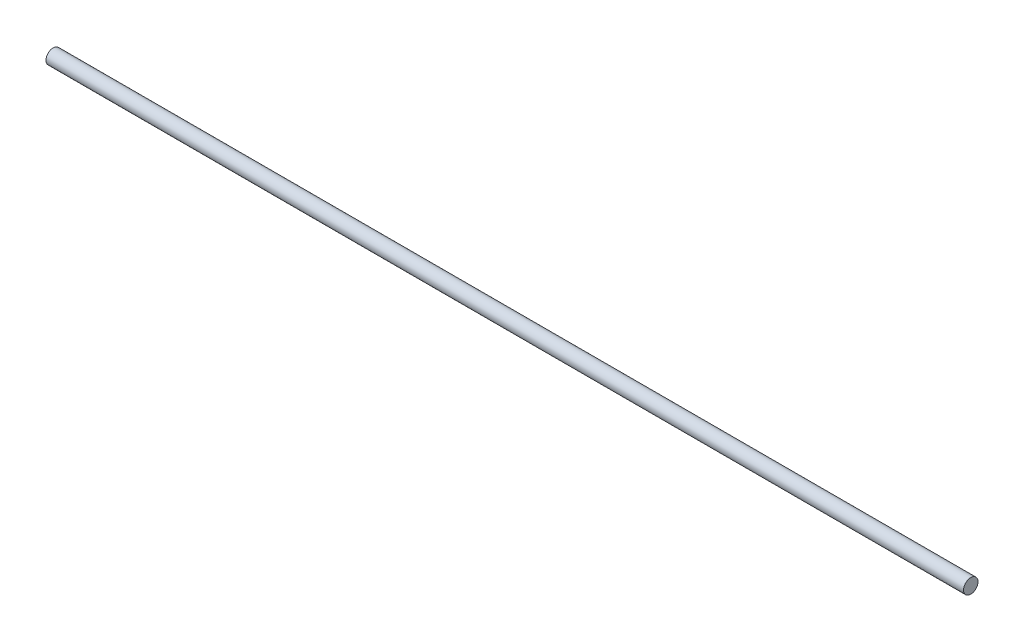
ISO-10303-21;
HEADER;
FILE_DESCRIPTION(('STEP AP214'),'2;1');
FILE_NAME('part.step','',(''),(''),'','','');
FILE_SCHEMA(('AUTOMOTIVE_DESIGN { 1 0 10303 214 1 1 1 1 }'));
ENDSEC;
DATA;
#1=APPLICATION_CONTEXT('core data for automotive mechanical design processes');
#2=APPLICATION_PROTOCOL_DEFINITION('international standard','automotive_design',2000,#1);
#3=PRODUCT_CONTEXT('',#1,'mechanical');
#4=PRODUCT('Part','Part','',(#3));
#5=PRODUCT_RELATED_PRODUCT_CATEGORY('part','',(#4));
#6=PRODUCT_DEFINITION_FORMATION('','',#4);
#7=PRODUCT_DEFINITION_CONTEXT('part definition',#1,'design');
#8=PRODUCT_DEFINITION('design','',#6,#7);
#9=PRODUCT_DEFINITION_SHAPE('','',#8);
#10=(LENGTH_UNIT() NAMED_UNIT(*) SI_UNIT(.MILLI.,.METRE.));
#11=(NAMED_UNIT(*) PLANE_ANGLE_UNIT() SI_UNIT($,.RADIAN.));
#12=(NAMED_UNIT(*) SI_UNIT($,.STERADIAN.) SOLID_ANGLE_UNIT());
#13=UNCERTAINTY_MEASURE_WITH_UNIT(LENGTH_MEASURE(1.E-05),#10,'distance_accuracy_value','');
#14=(GEOMETRIC_REPRESENTATION_CONTEXT(3) GLOBAL_UNCERTAINTY_ASSIGNED_CONTEXT((#13)) GLOBAL_UNIT_ASSIGNED_CONTEXT((#10,
#11,#12)) REPRESENTATION_CONTEXT('',''));
#15=CARTESIAN_POINT('',(0.,0.,0.));
#16=DIRECTION('',(0.,0.,1.));
#17=DIRECTION('',(1.,0.,0.));
#18=AXIS2_PLACEMENT_3D('',#15,#16,#17);
#19=CARTESIAN_POINT('',(381.,0.,0.));
#20=DIRECTION('',(-1.,0.,0.));
#21=DIRECTION('',(0.,0.,1.));
#22=AXIS2_PLACEMENT_3D('',#19,#20,#21);
#23=CYLINDRICAL_SURFACE('',#22,6.);
#24=CARTESIAN_POINT('',(381.,0.,0.));
#25=DIRECTION('',(1.,0.,0.));
#26=DIRECTION('',(0.,0.,-1.));
#27=AXIS2_PLACEMENT_3D('',#24,#25,#26);
#28=CIRCLE('',#27,6.);
#29=CARTESIAN_POINT('',(381.,0.,-6.));
#30=VERTEX_POINT('',#29);
#31=EDGE_CURVE('E10',#30,#30,#28,.T.);
#32=ORIENTED_EDGE('',*,*,#31,.F.);
#33=EDGE_LOOP('',(#32));
#34=FACE_BOUND('',#33,.T.);
#35=CARTESIAN_POINT('',(-381.,0.,0.));
#36=DIRECTION('',(1.,0.,0.));
#37=DIRECTION('',(0.,0.,-1.));
#38=AXIS2_PLACEMENT_3D('',#35,#36,#37);
#39=CIRCLE('',#38,6.);
#40=CARTESIAN_POINT('',(-381.,0.,-6.));
#41=VERTEX_POINT('',#40);
#42=EDGE_CURVE('E34',#41,#41,#39,.T.);
#43=ORIENTED_EDGE('',*,*,#42,.T.);
#44=EDGE_LOOP('',(#43));
#45=FACE_BOUND('',#44,.T.);
#46=ADVANCED_FACE('F31',(#34,#45),#23,.T.);
#47=CARTESIAN_POINT('',(381.,0.,0.));
#48=DIRECTION('',(1.,0.,0.));
#49=DIRECTION('',(0.,0.,-1.));
#50=AXIS2_PLACEMENT_3D('',#47,#48,#49);
#51=PLANE('',#50);
#52=ORIENTED_EDGE('',*,*,#31,.T.);
#53=EDGE_LOOP('',(#52));
#54=FACE_BOUND('',#53,.T.);
#55=ADVANCED_FACE('F46',(#54),#51,.T.);
#56=CARTESIAN_POINT('',(-381.,0.,0.));
#57=DIRECTION('',(1.,0.,0.));
#58=DIRECTION('',(0.,0.,-1.));
#59=AXIS2_PLACEMENT_3D('',#56,#57,#58);
#60=PLANE('',#59);
#61=ORIENTED_EDGE('',*,*,#42,.F.);
#62=EDGE_LOOP('',(#61));
#63=FACE_BOUND('',#62,.T.);
#64=ADVANCED_FACE('F44',(#63),#60,.F.);
#65=CLOSED_SHELL('',(#46,#55,#64));
#66=MANIFOLD_SOLID_BREP('B2',#65);
#67=ADVANCED_BREP_SHAPE_REPRESENTATION('',(#18,#66),#14);
#68=SHAPE_DEFINITION_REPRESENTATION(#9,#67);
ENDSEC;
END-ISO-10303-21;
